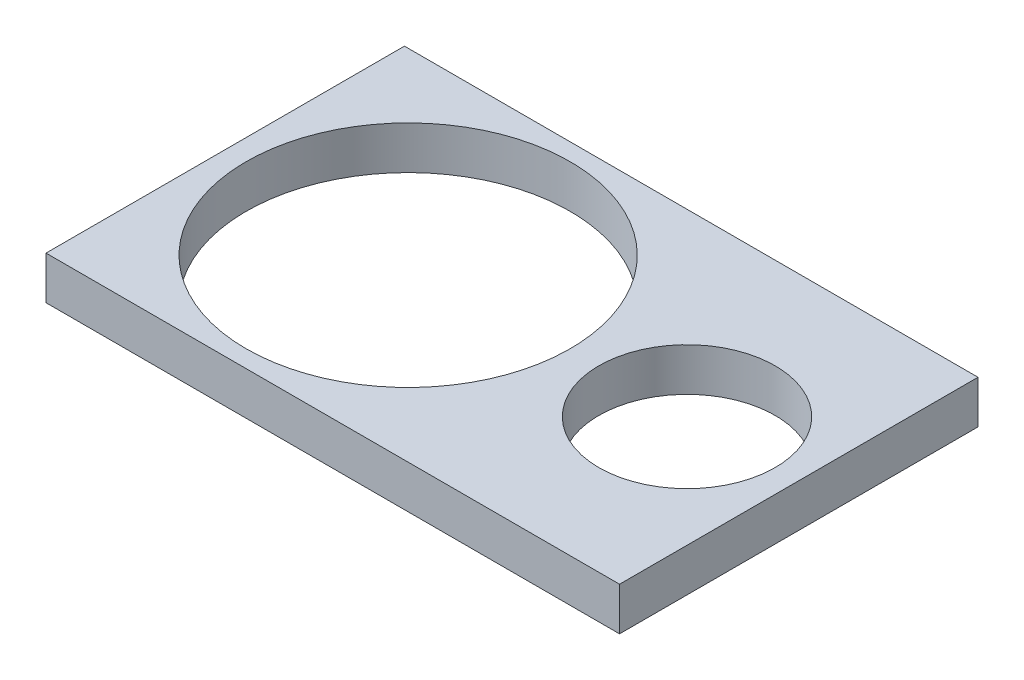
ISO-10303-21;
HEADER;
FILE_DESCRIPTION(('STEP AP214'),'2;1');
FILE_NAME('part.step','',(''),(''),'','','');
FILE_SCHEMA(('AUTOMOTIVE_DESIGN { 1 0 10303 214 1 1 1 1 }'));
ENDSEC;
DATA;
#1=APPLICATION_CONTEXT('core data for automotive mechanical design processes');
#2=APPLICATION_PROTOCOL_DEFINITION('international standard','automotive_design',2000,#1);
#3=PRODUCT_CONTEXT('',#1,'mechanical');
#4=PRODUCT('Part','Part','',(#3));
#5=PRODUCT_RELATED_PRODUCT_CATEGORY('part','',(#4));
#6=PRODUCT_DEFINITION_FORMATION('','',#4);
#7=PRODUCT_DEFINITION_CONTEXT('part definition',#1,'design');
#8=PRODUCT_DEFINITION('design','',#6,#7);
#9=PRODUCT_DEFINITION_SHAPE('','',#8);
#10=(LENGTH_UNIT() NAMED_UNIT(*) SI_UNIT(.MILLI.,.METRE.));
#11=(NAMED_UNIT(*) PLANE_ANGLE_UNIT() SI_UNIT($,.RADIAN.));
#12=(NAMED_UNIT(*) SI_UNIT($,.STERADIAN.) SOLID_ANGLE_UNIT());
#13=UNCERTAINTY_MEASURE_WITH_UNIT(LENGTH_MEASURE(1.E-05),#10,'distance_accuracy_value','');
#14=(GEOMETRIC_REPRESENTATION_CONTEXT(3) GLOBAL_UNCERTAINTY_ASSIGNED_CONTEXT((#13)) GLOBAL_UNIT_ASSIGNED_CONTEXT((#10,
#11,#12)) REPRESENTATION_CONTEXT('',''));
#15=CARTESIAN_POINT('',(0.,0.,0.));
#16=DIRECTION('',(0.,0.,1.));
#17=DIRECTION('',(1.,0.,0.));
#18=AXIS2_PLACEMENT_3D('',#15,#16,#17);
#19=CARTESIAN_POINT('',(20.,3.,12.5));
#20=DIRECTION('',(-1.,0.,0.));
#21=DIRECTION('',(0.,0.,1.));
#22=AXIS2_PLACEMENT_3D('',#19,#20,#21);
#23=PLANE('',#22);
#24=DIRECTION('',(0.,0.,-1.));
#25=VECTOR('',#24,1.);
#26=CARTESIAN_POINT('',(20.,0.,12.5));
#27=LINE('',#26,#25);
#28=CARTESIAN_POINT('',(20.,0.,12.5));
#29=VERTEX_POINT('',#28);
#30=CARTESIAN_POINT('',(20.,0.,-12.5));
#31=VERTEX_POINT('',#30);
#32=EDGE_CURVE('E96',#29,#31,#27,.T.);
#33=ORIENTED_EDGE('',*,*,#32,.T.);
#34=DIRECTION('',(0.,-1.,0.));
#35=VECTOR('',#34,1.);
#36=CARTESIAN_POINT('',(20.,3.,-12.5));
#37=LINE('',#36,#35);
#38=CARTESIAN_POINT('',(20.,3.,-12.5));
#39=VERTEX_POINT('',#38);
#40=EDGE_CURVE('E11',#39,#31,#37,.T.);
#41=ORIENTED_EDGE('',*,*,#40,.F.);
#42=DIRECTION('',(0.,0.,-1.));
#43=VECTOR('',#42,1.);
#44=CARTESIAN_POINT('',(20.,3.,12.5));
#45=LINE('',#44,#43);
#46=CARTESIAN_POINT('',(20.,3.,12.5));
#47=VERTEX_POINT('',#46);
#48=EDGE_CURVE('E84',#47,#39,#45,.T.);
#49=ORIENTED_EDGE('',*,*,#48,.F.);
#50=DIRECTION('',(0.,-1.,0.));
#51=VECTOR('',#50,1.);
#52=CARTESIAN_POINT('',(20.,3.,12.5));
#53=LINE('',#52,#51);
#54=EDGE_CURVE('E92',#47,#29,#53,.T.);
#55=ORIENTED_EDGE('',*,*,#54,.T.);
#56=EDGE_LOOP('',(#33,#41,#49,#55));
#57=FACE_BOUND('',#56,.T.);
#58=ADVANCED_FACE('F33',(#57),#23,.F.);
#59=CARTESIAN_POINT('',(-20.,3.,-12.5));
#60=DIRECTION('',(0.,0.,1.));
#61=DIRECTION('',(1.,0.,0.));
#62=AXIS2_PLACEMENT_3D('',#59,#60,#61);
#63=PLANE('',#62);
#64=DIRECTION('',(-1.,0.,0.));
#65=VECTOR('',#64,1.);
#66=CARTESIAN_POINT('',(-20.,0.,-12.5));
#67=LINE('',#66,#65);
#68=CARTESIAN_POINT('',(-20.,0.,-12.5));
#69=VERTEX_POINT('',#68);
#70=EDGE_CURVE('E88',#31,#69,#67,.T.);
#71=ORIENTED_EDGE('',*,*,#70,.T.);
#72=DIRECTION('',(0.,-1.,0.));
#73=VECTOR('',#72,1.);
#74=CARTESIAN_POINT('',(-20.,3.,-12.5));
#75=LINE('',#74,#73);
#76=CARTESIAN_POINT('',(-20.,3.,-12.5));
#77=VERTEX_POINT('',#76);
#78=EDGE_CURVE('E41',#77,#69,#75,.T.);
#79=ORIENTED_EDGE('',*,*,#78,.F.);
#80=DIRECTION('',(-1.,0.,0.));
#81=VECTOR('',#80,1.);
#82=CARTESIAN_POINT('',(-20.,3.,-12.5));
#83=LINE('',#82,#81);
#84=EDGE_CURVE('E79',#39,#77,#83,.T.);
#85=ORIENTED_EDGE('',*,*,#84,.F.);
#86=ORIENTED_EDGE('',*,*,#40,.T.);
#87=EDGE_LOOP('',(#71,#79,#85,#86));
#88=FACE_BOUND('',#87,.T.);
#89=ADVANCED_FACE('F87',(#88),#63,.F.);
#90=CARTESIAN_POINT('',(-20.,3.,12.5));
#91=DIRECTION('',(1.,0.,0.));
#92=DIRECTION('',(0.,0.,-1.));
#93=AXIS2_PLACEMENT_3D('',#90,#91,#92);
#94=PLANE('',#93);
#95=DIRECTION('',(0.,0.,1.));
#96=VECTOR('',#95,1.);
#97=CARTESIAN_POINT('',(-20.,0.,12.5));
#98=LINE('',#97,#96);
#99=CARTESIAN_POINT('',(-20.,0.,12.5));
#100=VERTEX_POINT('',#99);
#101=EDGE_CURVE('E66',#69,#100,#98,.T.);
#102=ORIENTED_EDGE('',*,*,#101,.T.);
#103=DIRECTION('',(0.,-1.,0.));
#104=VECTOR('',#103,1.);
#105=CARTESIAN_POINT('',(-20.,3.,12.5));
#106=LINE('',#105,#104);
#107=CARTESIAN_POINT('',(-20.,3.,12.5));
#108=VERTEX_POINT('',#107);
#109=EDGE_CURVE('E89',#108,#100,#106,.T.);
#110=ORIENTED_EDGE('',*,*,#109,.F.);
#111=DIRECTION('',(0.,0.,1.));
#112=VECTOR('',#111,1.);
#113=CARTESIAN_POINT('',(-20.,3.,12.5));
#114=LINE('',#113,#112);
#115=EDGE_CURVE('E82',#77,#108,#114,.T.);
#116=ORIENTED_EDGE('',*,*,#115,.F.);
#117=ORIENTED_EDGE('',*,*,#78,.T.);
#118=EDGE_LOOP('',(#102,#110,#116,#117));
#119=FACE_BOUND('',#118,.T.);
#120=ADVANCED_FACE('F90',(#119),#94,.F.);
#121=CARTESIAN_POINT('',(-20.,3.,12.5));
#122=DIRECTION('',(0.,0.,-1.));
#123=DIRECTION('',(-1.,0.,0.));
#124=AXIS2_PLACEMENT_3D('',#121,#122,#123);
#125=PLANE('',#124);
#126=DIRECTION('',(1.,0.,0.));
#127=VECTOR('',#126,1.);
#128=CARTESIAN_POINT('',(-20.,0.,12.5));
#129=LINE('',#128,#127);
#130=EDGE_CURVE('E72',#100,#29,#129,.T.);
#131=ORIENTED_EDGE('',*,*,#130,.T.);
#132=ORIENTED_EDGE('',*,*,#54,.F.);
#133=DIRECTION('',(1.,0.,0.));
#134=VECTOR('',#133,1.);
#135=CARTESIAN_POINT('',(-20.,3.,12.5));
#136=LINE('',#135,#134);
#137=EDGE_CURVE('E49',#108,#47,#136,.T.);
#138=ORIENTED_EDGE('',*,*,#137,.F.);
#139=ORIENTED_EDGE('',*,*,#109,.T.);
#140=EDGE_LOOP('',(#131,#132,#138,#139));
#141=FACE_BOUND('',#140,.T.);
#142=ADVANCED_FACE('F104',(#141),#125,.F.);
#143=CARTESIAN_POINT('',(0.,3.,0.));
#144=DIRECTION('',(0.,-1.,0.));
#145=DIRECTION('',(0.,0.,-1.));
#146=AXIS2_PLACEMENT_3D('',#143,#144,#145);
#147=PLANE('',#146);
#148=CARTESIAN_POINT('',(-7.24405277457864,3.,0.));
#149=DIRECTION('',(0.,1.,0.));
#150=DIRECTION('',(0.,0.,1.));
#151=AXIS2_PLACEMENT_3D('',#148,#149,#150);
#152=CIRCLE('',#151,11.3);
#153=CARTESIAN_POINT('',(-7.24405277457864,3.,11.3));
#154=VERTEX_POINT('',#153);
#155=EDGE_CURVE('E116',#154,#154,#152,.T.);
#156=ORIENTED_EDGE('',*,*,#155,.F.);
#157=EDGE_LOOP('',(#156));
#158=FACE_BOUND('',#157,.T.);
#159=CARTESIAN_POINT('',(12.2339250155829,3.,0.0287435036924188));
#160=DIRECTION('',(0.,1.,0.));
#161=DIRECTION('',(0.,0.,1.));
#162=AXIS2_PLACEMENT_3D('',#159,#160,#161);
#163=CIRCLE('',#162,6.15);
#164=CARTESIAN_POINT('',(12.2339250155829,3.,6.17874350369242));
#165=VERTEX_POINT('',#164);
#166=EDGE_CURVE('E110',#165,#165,#163,.T.);
#167=ORIENTED_EDGE('',*,*,#166,.F.);
#168=EDGE_LOOP('',(#167));
#169=FACE_BOUND('',#168,.T.);
#170=ORIENTED_EDGE('',*,*,#48,.T.);
#171=ORIENTED_EDGE('',*,*,#84,.T.);
#172=ORIENTED_EDGE('',*,*,#115,.T.);
#173=ORIENTED_EDGE('',*,*,#137,.T.);
#174=EDGE_LOOP('',(#170,#171,#172,#173));
#175=FACE_BOUND('',#174,.T.);
#176=ADVANCED_FACE('F80',(#158,#169,#175),#147,.F.);
#177=CARTESIAN_POINT('',(0.,0.,0.));
#178=DIRECTION('',(0.,-1.,0.));
#179=DIRECTION('',(0.,0.,-1.));
#180=AXIS2_PLACEMENT_3D('',#177,#178,#179);
#181=PLANE('',#180);
#182=CARTESIAN_POINT('',(-7.24405277457864,0.,0.));
#183=DIRECTION('',(0.,1.,0.));
#184=DIRECTION('',(0.,0.,1.));
#185=AXIS2_PLACEMENT_3D('',#182,#183,#184);
#186=CIRCLE('',#185,11.3);
#187=CARTESIAN_POINT('',(-7.24405277457864,0.,11.3));
#188=VERTEX_POINT('',#187);
#189=EDGE_CURVE('E99',#188,#188,#186,.T.);
#190=ORIENTED_EDGE('',*,*,#189,.T.);
#191=EDGE_LOOP('',(#190));
#192=FACE_BOUND('',#191,.T.);
#193=CARTESIAN_POINT('',(12.2339250155829,0.,0.0287435036924188));
#194=DIRECTION('',(0.,1.,0.));
#195=DIRECTION('',(0.,0.,1.));
#196=AXIS2_PLACEMENT_3D('',#193,#194,#195);
#197=CIRCLE('',#196,6.15);
#198=CARTESIAN_POINT('',(12.2339250155829,0.,6.17874350369242));
#199=VERTEX_POINT('',#198);
#200=EDGE_CURVE('E113',#199,#199,#197,.T.);
#201=ORIENTED_EDGE('',*,*,#200,.T.);
#202=EDGE_LOOP('',(#201));
#203=FACE_BOUND('',#202,.T.);
#204=ORIENTED_EDGE('',*,*,#32,.F.);
#205=ORIENTED_EDGE('',*,*,#130,.F.);
#206=ORIENTED_EDGE('',*,*,#101,.F.);
#207=ORIENTED_EDGE('',*,*,#70,.F.);
#208=EDGE_LOOP('',(#204,#205,#206,#207));
#209=FACE_BOUND('',#208,.T.);
#210=ADVANCED_FACE('F107',(#192,#203,#209),#181,.T.);
#211=CARTESIAN_POINT('',(12.2339250155829,0.,0.0287435036924188));
#212=DIRECTION('',(0.,1.,0.));
#213=DIRECTION('',(0.,0.,1.));
#214=AXIS2_PLACEMENT_3D('',#211,#212,#213);
#215=CYLINDRICAL_SURFACE('',#214,6.15);
#216=ORIENTED_EDGE('',*,*,#200,.F.);
#217=EDGE_LOOP('',(#216));
#218=FACE_BOUND('',#217,.T.);
#219=ORIENTED_EDGE('',*,*,#166,.T.);
#220=EDGE_LOOP('',(#219));
#221=FACE_BOUND('',#220,.T.);
#222=ADVANCED_FACE('F127',(#218,#221),#215,.F.);
#223=CARTESIAN_POINT('',(-7.24405277457864,0.,0.));
#224=DIRECTION('',(0.,1.,0.));
#225=DIRECTION('',(0.,0.,1.));
#226=AXIS2_PLACEMENT_3D('',#223,#224,#225);
#227=CYLINDRICAL_SURFACE('',#226,11.3);
#228=ORIENTED_EDGE('',*,*,#189,.F.);
#229=EDGE_LOOP('',(#228));
#230=FACE_BOUND('',#229,.T.);
#231=ORIENTED_EDGE('',*,*,#155,.T.);
#232=EDGE_LOOP('',(#231));
#233=FACE_BOUND('',#232,.T.);
#234=ADVANCED_FACE('F124',(#230,#233),#227,.F.);
#235=CLOSED_SHELL('',(#58,#89,#120,#142,#176,#210,#222,#234));
#236=MANIFOLD_SOLID_BREP('B2',#235);
#237=ADVANCED_BREP_SHAPE_REPRESENTATION('',(#18,#236),#14);
#238=SHAPE_DEFINITION_REPRESENTATION(#9,#237);
ENDSEC;
END-ISO-10303-21;
